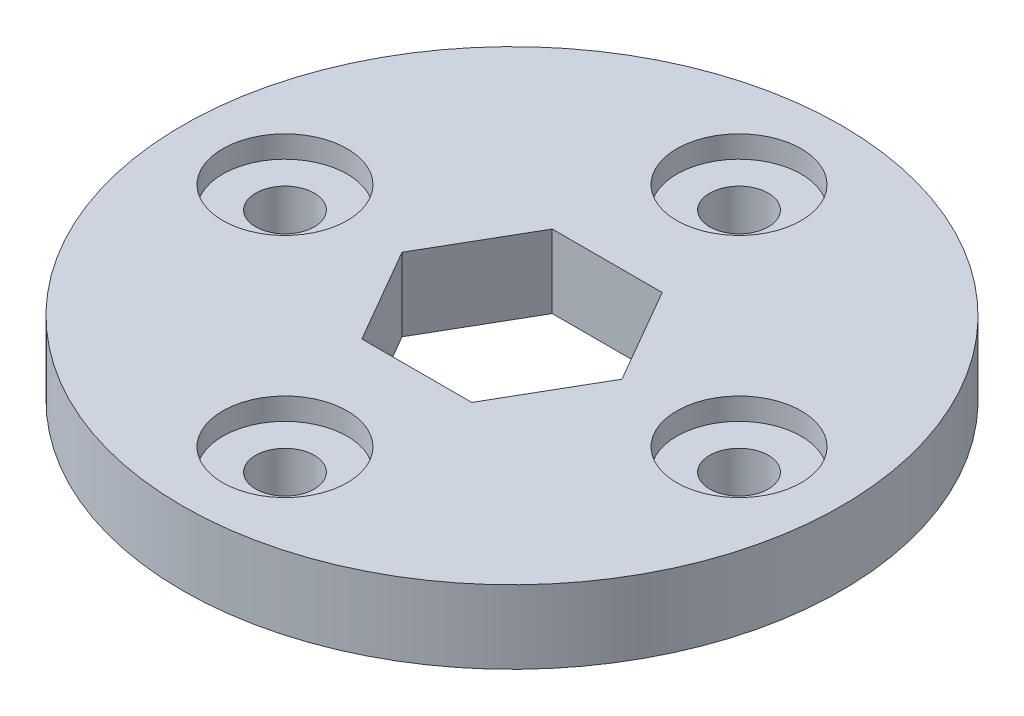
ISO-10303-21;
HEADER;
FILE_DESCRIPTION(('STEP AP214'),'2;1');
FILE_NAME('part.step','',(''),(''),'','','');
FILE_SCHEMA(('AUTOMOTIVE_DESIGN { 1 0 10303 214 1 1 1 1 }'));
ENDSEC;
DATA;
#1=APPLICATION_CONTEXT('core data for automotive mechanical design processes');
#2=APPLICATION_PROTOCOL_DEFINITION('international standard','automotive_design',2000,#1);
#3=PRODUCT_CONTEXT('',#1,'mechanical');
#4=PRODUCT('Part','Part','',(#3));
#5=PRODUCT_RELATED_PRODUCT_CATEGORY('part','',(#4));
#6=PRODUCT_DEFINITION_FORMATION('','',#4);
#7=PRODUCT_DEFINITION_CONTEXT('part definition',#1,'design');
#8=PRODUCT_DEFINITION('design','',#6,#7);
#9=PRODUCT_DEFINITION_SHAPE('','',#8);
#10=(LENGTH_UNIT() NAMED_UNIT(*) SI_UNIT(.MILLI.,.METRE.));
#11=(NAMED_UNIT(*) PLANE_ANGLE_UNIT() SI_UNIT($,.RADIAN.));
#12=(NAMED_UNIT(*) SI_UNIT($,.STERADIAN.) SOLID_ANGLE_UNIT());
#13=UNCERTAINTY_MEASURE_WITH_UNIT(LENGTH_MEASURE(1.E-05),#10,'distance_accuracy_value','');
#14=(GEOMETRIC_REPRESENTATION_CONTEXT(3) GLOBAL_UNCERTAINTY_ASSIGNED_CONTEXT((#13)) GLOBAL_UNIT_ASSIGNED_CONTEXT((#10,
#11,#12)) REPRESENTATION_CONTEXT('',''));
#15=CARTESIAN_POINT('',(0.,0.,0.));
#16=DIRECTION('',(0.,0.,1.));
#17=DIRECTION('',(1.,0.,0.));
#18=AXIS2_PLACEMENT_3D('',#15,#16,#17);
#19=CARTESIAN_POINT('',(0.,5.,-15.5));
#20=DIRECTION('',(0.,-1.,0.));
#21=DIRECTION('',(0.,0.,-1.));
#22=AXIS2_PLACEMENT_3D('',#19,#20,#21);
#23=CYLINDRICAL_SURFACE('',#22,2.);
#24=CARTESIAN_POINT('',(0.,0.,-15.5));
#25=DIRECTION('',(0.,1.,0.));
#26=DIRECTION('',(0.,0.,1.));
#27=AXIS2_PLACEMENT_3D('',#24,#25,#26);
#28=CIRCLE('',#27,2.);
#29=CARTESIAN_POINT('',(0.,0.,-13.5));
#30=VERTEX_POINT('',#29);
#31=EDGE_CURVE('E121',#30,#30,#28,.T.);
#32=ORIENTED_EDGE('',*,*,#31,.F.);
#33=EDGE_LOOP('',(#32));
#34=FACE_BOUND('',#33,.T.);
#35=CARTESIAN_POINT('',(0.,3.5,-15.5));
#36=DIRECTION('',(0.,1.,0.));
#37=DIRECTION('',(0.,0.,1.));
#38=AXIS2_PLACEMENT_3D('',#35,#36,#37);
#39=CIRCLE('',#38,2.);
#40=CARTESIAN_POINT('',(0.,3.5,-13.5));
#41=VERTEX_POINT('',#40);
#42=EDGE_CURVE('E37',#41,#41,#39,.T.);
#43=ORIENTED_EDGE('',*,*,#42,.T.);
#44=EDGE_LOOP('',(#43));
#45=FACE_BOUND('',#44,.T.);
#46=ADVANCED_FACE('F33',(#34,#45),#23,.F.);
#47=CARTESIAN_POINT('',(15.5000000000006,5.,-5.94375988270211E-13));
#48=DIRECTION('',(0.,-1.,0.));
#49=DIRECTION('',(0.,0.,-1.));
#50=AXIS2_PLACEMENT_3D('',#47,#48,#49);
#51=CYLINDRICAL_SURFACE('',#50,2.00000000000006);
#52=CARTESIAN_POINT('',(15.5000000000006,0.,-5.94375988270211E-13));
#53=DIRECTION('',(0.,1.,0.));
#54=DIRECTION('',(0.,0.,1.));
#55=AXIS2_PLACEMENT_3D('',#52,#53,#54);
#56=CIRCLE('',#55,2.00000000000006);
#57=CARTESIAN_POINT('',(15.5000000000006,0.,1.99999999999947));
#58=VERTEX_POINT('',#57);
#59=EDGE_CURVE('E163',#58,#58,#56,.T.);
#60=ORIENTED_EDGE('',*,*,#59,.F.);
#61=EDGE_LOOP('',(#60));
#62=FACE_BOUND('',#61,.T.);
#63=CARTESIAN_POINT('',(15.5000000000006,3.5,-5.94375988270211E-13));
#64=DIRECTION('',(0.,1.,0.));
#65=DIRECTION('',(0.,0.,1.));
#66=AXIS2_PLACEMENT_3D('',#63,#64,#65);
#67=CIRCLE('',#66,2.00000000000006);
#68=CARTESIAN_POINT('',(15.5000000000006,3.5,1.99999999999947));
#69=VERTEX_POINT('',#68);
#70=EDGE_CURVE('E149',#69,#69,#67,.T.);
#71=ORIENTED_EDGE('',*,*,#70,.T.);
#72=EDGE_LOOP('',(#71));
#73=FACE_BOUND('',#72,.T.);
#74=ADVANCED_FACE('F177',(#62,#73),#51,.F.);
#75=CARTESIAN_POINT('',(1.18875197654042E-12,5.,15.5));
#76=DIRECTION('',(0.,-1.,0.));
#77=DIRECTION('',(0.,0.,-1.));
#78=AXIS2_PLACEMENT_3D('',#75,#76,#77);
#79=CYLINDRICAL_SURFACE('',#78,2.);
#80=CARTESIAN_POINT('',(1.18875197654042E-12,0.,15.5));
#81=DIRECTION('',(0.,1.,0.));
#82=DIRECTION('',(0.,0.,1.));
#83=AXIS2_PLACEMENT_3D('',#80,#81,#82);
#84=CIRCLE('',#83,2.);
#85=CARTESIAN_POINT('',(1.18875197654042E-12,0.,17.5));
#86=VERTEX_POINT('',#85);
#87=EDGE_CURVE('E158',#86,#86,#84,.T.);
#88=ORIENTED_EDGE('',*,*,#87,.F.);
#89=EDGE_LOOP('',(#88));
#90=FACE_BOUND('',#89,.T.);
#91=CARTESIAN_POINT('',(1.18875197654042E-12,3.5,15.5));
#92=DIRECTION('',(0.,1.,0.));
#93=DIRECTION('',(0.,0.,1.));
#94=AXIS2_PLACEMENT_3D('',#91,#92,#93);
#95=CIRCLE('',#94,2.);
#96=CARTESIAN_POINT('',(1.18875197654042E-12,3.5,17.5));
#97=VERTEX_POINT('',#96);
#98=EDGE_CURVE('E146',#97,#97,#95,.T.);
#99=ORIENTED_EDGE('',*,*,#98,.T.);
#100=EDGE_LOOP('',(#99));
#101=FACE_BOUND('',#100,.T.);
#102=ADVANCED_FACE('F182',(#90,#101),#79,.F.);
#103=CARTESIAN_POINT('',(-15.4999999999994,5.,5.96274190808889E-13));
#104=DIRECTION('',(0.,-1.,0.));
#105=DIRECTION('',(0.,0.,-1.));
#106=AXIS2_PLACEMENT_3D('',#103,#104,#105);
#107=CYLINDRICAL_SURFACE('',#106,1.99999999999998);
#108=CARTESIAN_POINT('',(-15.4999999999994,0.,5.96274190808889E-13));
#109=DIRECTION('',(0.,1.,0.));
#110=DIRECTION('',(0.,0.,1.));
#111=AXIS2_PLACEMENT_3D('',#108,#109,#110);
#112=CIRCLE('',#111,1.99999999999998);
#113=CARTESIAN_POINT('',(-15.4999999999994,0.,2.00000000000058));
#114=VERTEX_POINT('',#113);
#115=EDGE_CURVE('E154',#114,#114,#112,.T.);
#116=ORIENTED_EDGE('',*,*,#115,.F.);
#117=EDGE_LOOP('',(#116));
#118=FACE_BOUND('',#117,.T.);
#119=CARTESIAN_POINT('',(-15.4999999999994,3.5,5.96274190808889E-13));
#120=DIRECTION('',(0.,1.,0.));
#121=DIRECTION('',(0.,0.,1.));
#122=AXIS2_PLACEMENT_3D('',#119,#120,#121);
#123=CIRCLE('',#122,1.99999999999998);
#124=CARTESIAN_POINT('',(-15.4999999999994,3.5,2.00000000000058));
#125=VERTEX_POINT('',#124);
#126=EDGE_CURVE('E143',#125,#125,#123,.T.);
#127=ORIENTED_EDGE('',*,*,#126,.T.);
#128=EDGE_LOOP('',(#127));
#129=FACE_BOUND('',#128,.T.);
#130=ADVANCED_FACE('F208',(#118,#129),#107,.F.);
#131=CARTESIAN_POINT('',(0.,5.,0.));
#132=DIRECTION('',(0.,1.,0.));
#133=DIRECTION('',(0.,0.,1.));
#134=AXIS2_PLACEMENT_3D('',#131,#132,#133);
#135=PLANE('',#134);
#136=CARTESIAN_POINT('',(1.18875197654042E-12,5.,-15.5));
#137=DIRECTION('',(0.,1.,0.));
#138=DIRECTION('',(0.,0.,1.));
#139=AXIS2_PLACEMENT_3D('',#136,#137,#138);
#140=CIRCLE('',#139,4.25);
#141=CARTESIAN_POINT('',(1.18875197654042E-12,5.,-11.25));
#142=VERTEX_POINT('',#141);
#143=EDGE_CURVE('E405',#142,#142,#140,.T.);
#144=ORIENTED_EDGE('',*,*,#143,.F.);
#145=EDGE_LOOP('',(#144));
#146=FACE_BOUND('',#145,.T.);
#147=CARTESIAN_POINT('',(15.5,5.,1.18780287527108E-12));
#148=DIRECTION('',(0.,1.,0.));
#149=DIRECTION('',(0.,0.,1.));
#150=AXIS2_PLACEMENT_3D('',#147,#148,#149);
#151=CIRCLE('',#150,4.25);
#152=CARTESIAN_POINT('',(15.5,5.,4.25000000000119));
#153=VERTEX_POINT('',#152);
#154=EDGE_CURVE('E399',#153,#153,#151,.T.);
#155=ORIENTED_EDGE('',*,*,#154,.F.);
#156=EDGE_LOOP('',(#155));
#157=FACE_BOUND('',#156,.T.);
#158=CARTESIAN_POINT('',(-1.18685377400174E-12,5.,15.5));
#159=DIRECTION('',(0.,1.,0.));
#160=DIRECTION('',(0.,0.,1.));
#161=AXIS2_PLACEMENT_3D('',#158,#159,#160);
#162=CIRCLE('',#161,4.25);
#163=CARTESIAN_POINT('',(-1.18685377400174E-12,5.,19.75));
#164=VERTEX_POINT('',#163);
#165=EDGE_CURVE('E391',#164,#164,#162,.T.);
#166=ORIENTED_EDGE('',*,*,#165,.F.);
#167=EDGE_LOOP('',(#166));
#168=FACE_BOUND('',#167,.T.);
#169=CARTESIAN_POINT('',(-15.5,5.,-1.1859046727324E-12));
#170=DIRECTION('',(0.,1.,0.));
#171=DIRECTION('',(0.,0.,1.));
#172=AXIS2_PLACEMENT_3D('',#169,#170,#171);
#173=CIRCLE('',#172,4.25);
#174=CARTESIAN_POINT('',(-15.5,5.,4.24999999999881));
#175=VERTEX_POINT('',#174);
#176=EDGE_CURVE('E166',#175,#175,#173,.T.);
#177=ORIENTED_EDGE('',*,*,#176,.F.);
#178=EDGE_LOOP('',(#177));
#179=FACE_BOUND('',#178,.T.);
#180=CARTESIAN_POINT('',(0.,5.,0.));
#181=DIRECTION('',(0.,1.,0.));
#182=DIRECTION('',(0.,0.,1.));
#183=AXIS2_PLACEMENT_3D('',#180,#181,#182);
#184=CIRCLE('',#183,22.5);
#185=CARTESIAN_POINT('',(0.,5.,22.5));
#186=VERTEX_POINT('',#185);
#187=EDGE_CURVE('E11',#186,#186,#184,.T.);
#188=ORIENTED_EDGE('',*,*,#187,.T.);
#189=EDGE_LOOP('',(#188));
#190=FACE_BOUND('',#189,.T.);
#191=DIRECTION('',(-0.5,0.,-0.866025403784439));
#192=VECTOR('',#191,1.);
#193=CARTESIAN_POINT('',(7.50555349946513,5.,0.));
#194=LINE('',#193,#192);
#195=CARTESIAN_POINT('',(7.50555349946513,5.,0.));
#196=VERTEX_POINT('',#195);
#197=CARTESIAN_POINT('',(3.75277674973256,5.,-6.5));
#198=VERTEX_POINT('',#197);
#199=EDGE_CURVE('E96',#196,#198,#194,.T.);
#200=ORIENTED_EDGE('',*,*,#199,.F.);
#201=DIRECTION('',(0.5,0.,-0.866025403784439));
#202=VECTOR('',#201,1.);
#203=CARTESIAN_POINT('',(3.75277674973257,5.,6.5));
#204=LINE('',#203,#202);
#205=CARTESIAN_POINT('',(3.75277674973257,5.,6.5));
#206=VERTEX_POINT('',#205);
#207=EDGE_CURVE('E88',#206,#196,#204,.T.);
#208=ORIENTED_EDGE('',*,*,#207,.F.);
#209=DIRECTION('',(1.,0.,0.));
#210=VECTOR('',#209,1.);
#211=CARTESIAN_POINT('',(-3.75277674973257,5.,6.5));
#212=LINE('',#211,#210);
#213=CARTESIAN_POINT('',(-3.75277674973257,5.,6.5));
#214=VERTEX_POINT('',#213);
#215=EDGE_CURVE('E118',#214,#206,#212,.T.);
#216=ORIENTED_EDGE('',*,*,#215,.F.);
#217=DIRECTION('',(0.5,0.,0.866025403784439));
#218=VECTOR('',#217,1.);
#219=CARTESIAN_POINT('',(-7.50555349946514,5.,0.));
#220=LINE('',#219,#218);
#221=CARTESIAN_POINT('',(-7.50555349946514,5.,0.));
#222=VERTEX_POINT('',#221);
#223=EDGE_CURVE('E116',#222,#214,#220,.T.);
#224=ORIENTED_EDGE('',*,*,#223,.F.);
#225=DIRECTION('',(-0.5,0.,0.866025403784439));
#226=VECTOR('',#225,1.);
#227=CARTESIAN_POINT('',(-3.75277674973257,5.,-6.5));
#228=LINE('',#227,#226);
#229=CARTESIAN_POINT('',(-3.75277674973257,5.,-6.5));
#230=VERTEX_POINT('',#229);
#231=EDGE_CURVE('E111',#230,#222,#228,.T.);
#232=ORIENTED_EDGE('',*,*,#231,.F.);
#233=DIRECTION('',(-1.,0.,0.));
#234=VECTOR('',#233,1.);
#235=CARTESIAN_POINT('',(3.75277674973256,5.,-6.5));
#236=LINE('',#235,#234);
#237=EDGE_CURVE('E109',#198,#230,#236,.T.);
#238=ORIENTED_EDGE('',*,*,#237,.F.);
#239=EDGE_LOOP('',(#200,#208,#216,#224,#232,#238));
#240=FACE_BOUND('',#239,.T.);
#241=ADVANCED_FACE('F107',(#146,#157,#168,#179,#190,#240),#135,.T.);
#242=CARTESIAN_POINT('',(0.,0.,0.));
#243=DIRECTION('',(0.,1.,0.));
#244=DIRECTION('',(0.,0.,1.));
#245=AXIS2_PLACEMENT_3D('',#242,#243,#244);
#246=PLANE('',#245);
#247=CARTESIAN_POINT('',(0.,0.,0.));
#248=DIRECTION('',(0.,1.,0.));
#249=DIRECTION('',(0.,0.,1.));
#250=AXIS2_PLACEMENT_3D('',#247,#248,#249);
#251=CIRCLE('',#250,22.5);
#252=CARTESIAN_POINT('',(0.,0.,22.5));
#253=VERTEX_POINT('',#252);
#254=EDGE_CURVE('E42',#253,#253,#251,.T.);
#255=ORIENTED_EDGE('',*,*,#254,.F.);
#256=EDGE_LOOP('',(#255));
#257=FACE_BOUND('',#256,.T.);
#258=DIRECTION('',(0.5,0.,-0.866025403784439));
#259=VECTOR('',#258,1.);
#260=CARTESIAN_POINT('',(3.75277674973257,0.,6.5));
#261=LINE('',#260,#259);
#262=CARTESIAN_POINT('',(3.75277674973257,0.,6.5));
#263=VERTEX_POINT('',#262);
#264=CARTESIAN_POINT('',(7.50555349946513,0.,0.));
#265=VERTEX_POINT('',#264);
#266=EDGE_CURVE('E58',#263,#265,#261,.T.);
#267=ORIENTED_EDGE('',*,*,#266,.T.);
#268=DIRECTION('',(-0.5,0.,-0.866025403784439));
#269=VECTOR('',#268,1.);
#270=CARTESIAN_POINT('',(7.50555349946513,0.,0.));
#271=LINE('',#270,#269);
#272=CARTESIAN_POINT('',(3.75277674973256,0.,-6.5));
#273=VERTEX_POINT('',#272);
#274=EDGE_CURVE('E103',#265,#273,#271,.T.);
#275=ORIENTED_EDGE('',*,*,#274,.T.);
#276=DIRECTION('',(-1.,0.,0.));
#277=VECTOR('',#276,1.);
#278=CARTESIAN_POINT('',(3.75277674973256,0.,-6.5));
#279=LINE('',#278,#277);
#280=CARTESIAN_POINT('',(-3.75277674973257,0.,-6.5));
#281=VERTEX_POINT('',#280);
#282=EDGE_CURVE('E123',#273,#281,#279,.T.);
#283=ORIENTED_EDGE('',*,*,#282,.T.);
#284=DIRECTION('',(-0.5,0.,0.866025403784439));
#285=VECTOR('',#284,1.);
#286=CARTESIAN_POINT('',(-3.75277674973257,0.,-6.5));
#287=LINE('',#286,#285);
#288=CARTESIAN_POINT('',(-7.50555349946514,0.,0.));
#289=VERTEX_POINT('',#288);
#290=EDGE_CURVE('E126',#281,#289,#287,.T.);
#291=ORIENTED_EDGE('',*,*,#290,.T.);
#292=DIRECTION('',(0.5,0.,0.866025403784439));
#293=VECTOR('',#292,1.);
#294=CARTESIAN_POINT('',(-7.50555349946514,0.,0.));
#295=LINE('',#294,#293);
#296=CARTESIAN_POINT('',(-3.75277674973257,0.,6.5));
#297=VERTEX_POINT('',#296);
#298=EDGE_CURVE('E129',#289,#297,#295,.T.);
#299=ORIENTED_EDGE('',*,*,#298,.T.);
#300=DIRECTION('',(1.,0.,0.));
#301=VECTOR('',#300,1.);
#302=CARTESIAN_POINT('',(-3.75277674973257,0.,6.5));
#303=LINE('',#302,#301);
#304=EDGE_CURVE('E97',#297,#263,#303,.T.);
#305=ORIENTED_EDGE('',*,*,#304,.T.);
#306=EDGE_LOOP('',(#267,#275,#283,#291,#299,#305));
#307=FACE_BOUND('',#306,.T.);
#308=ORIENTED_EDGE('',*,*,#31,.T.);
#309=EDGE_LOOP('',(#308));
#310=FACE_BOUND('',#309,.T.);
#311=ORIENTED_EDGE('',*,*,#59,.T.);
#312=EDGE_LOOP('',(#311));
#313=FACE_BOUND('',#312,.T.);
#314=ORIENTED_EDGE('',*,*,#87,.T.);
#315=EDGE_LOOP('',(#314));
#316=FACE_BOUND('',#315,.T.);
#317=ORIENTED_EDGE('',*,*,#115,.T.);
#318=EDGE_LOOP('',(#317));
#319=FACE_BOUND('',#318,.T.);
#320=ADVANCED_FACE('F173',(#257,#307,#310,#313,#316,#319),#246,.F.);
#321=CARTESIAN_POINT('',(0.,5.,0.));
#322=DIRECTION('',(0.,-1.,0.));
#323=DIRECTION('',(0.,0.,-1.));
#324=AXIS2_PLACEMENT_3D('',#321,#322,#323);
#325=CYLINDRICAL_SURFACE('',#324,22.5);
#326=ORIENTED_EDGE('',*,*,#187,.F.);
#327=EDGE_LOOP('',(#326));
#328=FACE_BOUND('',#327,.T.);
#329=ORIENTED_EDGE('',*,*,#254,.T.);
#330=EDGE_LOOP('',(#329));
#331=FACE_BOUND('',#330,.T.);
#332=ADVANCED_FACE('F35',(#328,#331),#325,.T.);
#333=CARTESIAN_POINT('',(3.75277674973257,5.,6.5));
#334=DIRECTION('',(-0.866025403784439,0.,-0.5));
#335=DIRECTION('',(-0.5,0.,0.866025403784439));
#336=AXIS2_PLACEMENT_3D('',#333,#334,#335);
#337=PLANE('',#336);
#338=ORIENTED_EDGE('',*,*,#266,.F.);
#339=DIRECTION('',(0.,-1.,0.));
#340=VECTOR('',#339,1.);
#341=CARTESIAN_POINT('',(3.75277674973257,5.,6.5));
#342=LINE('',#341,#340);
#343=EDGE_CURVE('E92',#206,#263,#342,.T.);
#344=ORIENTED_EDGE('',*,*,#343,.F.);
#345=ORIENTED_EDGE('',*,*,#207,.T.);
#346=DIRECTION('',(0.,-1.,0.));
#347=VECTOR('',#346,1.);
#348=CARTESIAN_POINT('',(7.50555349946513,5.,0.));
#349=LINE('',#348,#347);
#350=EDGE_CURVE('E91',#196,#265,#349,.T.);
#351=ORIENTED_EDGE('',*,*,#350,.T.);
#352=EDGE_LOOP('',(#338,#344,#345,#351));
#353=FACE_BOUND('',#352,.T.);
#354=ADVANCED_FACE('F90',(#353),#337,.T.);
#355=CARTESIAN_POINT('',(7.50555349946513,5.,0.));
#356=DIRECTION('',(-0.866025403784438,0.,0.5));
#357=DIRECTION('',(0.5,0.,0.866025403784439));
#358=AXIS2_PLACEMENT_3D('',#355,#356,#357);
#359=PLANE('',#358);
#360=ORIENTED_EDGE('',*,*,#274,.F.);
#361=ORIENTED_EDGE('',*,*,#350,.F.);
#362=ORIENTED_EDGE('',*,*,#199,.T.);
#363=DIRECTION('',(0.,-1.,0.));
#364=VECTOR('',#363,1.);
#365=CARTESIAN_POINT('',(3.75277674973256,5.,-6.5));
#366=LINE('',#365,#364);
#367=EDGE_CURVE('E104',#198,#273,#366,.T.);
#368=ORIENTED_EDGE('',*,*,#367,.T.);
#369=EDGE_LOOP('',(#360,#361,#362,#368));
#370=FACE_BOUND('',#369,.T.);
#371=ADVANCED_FACE('F100',(#370),#359,.T.);
#372=CARTESIAN_POINT('',(3.75277674973256,5.,-6.5));
#373=DIRECTION('',(0.,0.,1.));
#374=DIRECTION('',(1.,0.,0.));
#375=AXIS2_PLACEMENT_3D('',#372,#373,#374);
#376=PLANE('',#375);
#377=ORIENTED_EDGE('',*,*,#282,.F.);
#378=ORIENTED_EDGE('',*,*,#367,.F.);
#379=ORIENTED_EDGE('',*,*,#237,.T.);
#380=DIRECTION('',(0.,-1.,0.));
#381=VECTOR('',#380,1.);
#382=CARTESIAN_POINT('',(-3.75277674973257,5.,-6.5));
#383=LINE('',#382,#381);
#384=EDGE_CURVE('E138',#230,#281,#383,.T.);
#385=ORIENTED_EDGE('',*,*,#384,.T.);
#386=EDGE_LOOP('',(#377,#378,#379,#385));
#387=FACE_BOUND('',#386,.T.);
#388=ADVANCED_FACE('F198',(#387),#376,.T.);
#389=CARTESIAN_POINT('',(-3.75277674973257,5.,-6.5));
#390=DIRECTION('',(0.866025403784439,0.,0.5));
#391=DIRECTION('',(0.5,0.,-0.866025403784439));
#392=AXIS2_PLACEMENT_3D('',#389,#390,#391);
#393=PLANE('',#392);
#394=ORIENTED_EDGE('',*,*,#290,.F.);
#395=ORIENTED_EDGE('',*,*,#384,.F.);
#396=ORIENTED_EDGE('',*,*,#231,.T.);
#397=DIRECTION('',(0.,-1.,0.));
#398=VECTOR('',#397,1.);
#399=CARTESIAN_POINT('',(-7.50555349946514,5.,0.));
#400=LINE('',#399,#398);
#401=EDGE_CURVE('E136',#222,#289,#400,.T.);
#402=ORIENTED_EDGE('',*,*,#401,.T.);
#403=EDGE_LOOP('',(#394,#395,#396,#402));
#404=FACE_BOUND('',#403,.T.);
#405=ADVANCED_FACE('F194',(#404),#393,.T.);
#406=CARTESIAN_POINT('',(-7.50555349946514,5.,0.));
#407=DIRECTION('',(0.866025403784439,0.,-0.5));
#408=DIRECTION('',(-0.5,0.,-0.866025403784439));
#409=AXIS2_PLACEMENT_3D('',#406,#407,#408);
#410=PLANE('',#409);
#411=ORIENTED_EDGE('',*,*,#298,.F.);
#412=ORIENTED_EDGE('',*,*,#401,.F.);
#413=ORIENTED_EDGE('',*,*,#223,.T.);
#414=DIRECTION('',(0.,-1.,0.));
#415=VECTOR('',#414,1.);
#416=CARTESIAN_POINT('',(-3.75277674973257,5.,6.5));
#417=LINE('',#416,#415);
#418=EDGE_CURVE('E50',#214,#297,#417,.T.);
#419=ORIENTED_EDGE('',*,*,#418,.T.);
#420=EDGE_LOOP('',(#411,#412,#413,#419));
#421=FACE_BOUND('',#420,.T.);
#422=ADVANCED_FACE('F191',(#421),#410,.T.);
#423=CARTESIAN_POINT('',(-3.75277674973257,5.,6.5));
#424=DIRECTION('',(0.,0.,-1.));
#425=DIRECTION('',(-1.,0.,0.));
#426=AXIS2_PLACEMENT_3D('',#423,#424,#425);
#427=PLANE('',#426);
#428=ORIENTED_EDGE('',*,*,#304,.F.);
#429=ORIENTED_EDGE('',*,*,#418,.F.);
#430=ORIENTED_EDGE('',*,*,#215,.T.);
#431=ORIENTED_EDGE('',*,*,#343,.T.);
#432=EDGE_LOOP('',(#428,#429,#430,#431));
#433=FACE_BOUND('',#432,.T.);
#434=ADVANCED_FACE('F187',(#433),#427,.T.);
#435=CARTESIAN_POINT('',(-15.5,3.5,-1.1859046727324E-12));
#436=DIRECTION('',(0.,1.,0.));
#437=DIRECTION('',(0.,0.,1.));
#438=AXIS2_PLACEMENT_3D('',#435,#436,#437);
#439=CYLINDRICAL_SURFACE('',#438,4.25);
#440=CARTESIAN_POINT('',(-15.5,3.5,-1.1859046727324E-12));
#441=DIRECTION('',(0.,1.,0.));
#442=DIRECTION('',(0.,0.,1.));
#443=AXIS2_PLACEMENT_3D('',#440,#441,#442);
#444=CIRCLE('',#443,4.25);
#445=CARTESIAN_POINT('',(-15.5,3.5,4.24999999999881));
#446=VERTEX_POINT('',#445);
#447=EDGE_CURVE('E390',#446,#446,#444,.T.);
#448=ORIENTED_EDGE('',*,*,#447,.F.);
#449=EDGE_LOOP('',(#448));
#450=FACE_BOUND('',#449,.T.);
#451=ORIENTED_EDGE('',*,*,#176,.T.);
#452=EDGE_LOOP('',(#451));
#453=FACE_BOUND('',#452,.T.);
#454=ADVANCED_FACE('F190',(#450,#453),#439,.F.);
#455=CARTESIAN_POINT('',(-15.5,3.5,-1.1859046727324E-12));
#456=DIRECTION('',(0.,1.,0.));
#457=DIRECTION('',(0.,0.,1.));
#458=AXIS2_PLACEMENT_3D('',#455,#456,#457);
#459=PLANE('',#458);
#460=ORIENTED_EDGE('',*,*,#126,.F.);
#461=EDGE_LOOP('',(#460));
#462=FACE_BOUND('',#461,.T.);
#463=ORIENTED_EDGE('',*,*,#447,.T.);
#464=EDGE_LOOP('',(#463));
#465=FACE_BOUND('',#464,.T.);
#466=ADVANCED_FACE('F259',(#462,#465),#459,.T.);
#467=CARTESIAN_POINT('',(-1.18685377400174E-12,3.5,15.5));
#468=DIRECTION('',(0.,1.,0.));
#469=DIRECTION('',(0.,0.,1.));
#470=AXIS2_PLACEMENT_3D('',#467,#468,#469);
#471=CYLINDRICAL_SURFACE('',#470,4.25);
#472=CARTESIAN_POINT('',(-1.18685377400174E-12,3.5,15.5));
#473=DIRECTION('',(0.,1.,0.));
#474=DIRECTION('',(0.,0.,1.));
#475=AXIS2_PLACEMENT_3D('',#472,#473,#474);
#476=CIRCLE('',#475,4.25);
#477=CARTESIAN_POINT('',(-1.18685377400174E-12,3.5,19.75));
#478=VERTEX_POINT('',#477);
#479=EDGE_CURVE('E393',#478,#478,#476,.T.);
#480=ORIENTED_EDGE('',*,*,#479,.F.);
#481=EDGE_LOOP('',(#480));
#482=FACE_BOUND('',#481,.T.);
#483=ORIENTED_EDGE('',*,*,#165,.T.);
#484=EDGE_LOOP('',(#483));
#485=FACE_BOUND('',#484,.T.);
#486=ADVANCED_FACE('F268',(#482,#485),#471,.F.);
#487=CARTESIAN_POINT('',(-1.18685377400174E-12,3.5,15.5));
#488=DIRECTION('',(0.,1.,0.));
#489=DIRECTION('',(0.,0.,1.));
#490=AXIS2_PLACEMENT_3D('',#487,#488,#489);
#491=PLANE('',#490);
#492=ORIENTED_EDGE('',*,*,#98,.F.);
#493=EDGE_LOOP('',(#492));
#494=FACE_BOUND('',#493,.T.);
#495=ORIENTED_EDGE('',*,*,#479,.T.);
#496=EDGE_LOOP('',(#495));
#497=FACE_BOUND('',#496,.T.);
#498=ADVANCED_FACE('F276',(#494,#497),#491,.T.);
#499=CARTESIAN_POINT('',(15.5,3.5,1.18780287527108E-12));
#500=DIRECTION('',(0.,1.,0.));
#501=DIRECTION('',(0.,0.,1.));
#502=AXIS2_PLACEMENT_3D('',#499,#500,#501);
#503=CYLINDRICAL_SURFACE('',#502,4.25);
#504=CARTESIAN_POINT('',(15.5,3.5,1.18780287527108E-12));
#505=DIRECTION('',(0.,1.,0.));
#506=DIRECTION('',(0.,0.,1.));
#507=AXIS2_PLACEMENT_3D('',#504,#505,#506);
#508=CIRCLE('',#507,4.25);
#509=CARTESIAN_POINT('',(15.5,3.5,4.25000000000119));
#510=VERTEX_POINT('',#509);
#511=EDGE_CURVE('E402',#510,#510,#508,.T.);
#512=ORIENTED_EDGE('',*,*,#511,.F.);
#513=EDGE_LOOP('',(#512));
#514=FACE_BOUND('',#513,.T.);
#515=ORIENTED_EDGE('',*,*,#154,.T.);
#516=EDGE_LOOP('',(#515));
#517=FACE_BOUND('',#516,.T.);
#518=ADVANCED_FACE('F284',(#514,#517),#503,.F.);
#519=CARTESIAN_POINT('',(15.5,3.5,1.18780287527108E-12));
#520=DIRECTION('',(0.,1.,0.));
#521=DIRECTION('',(0.,0.,1.));
#522=AXIS2_PLACEMENT_3D('',#519,#520,#521);
#523=PLANE('',#522);
#524=ORIENTED_EDGE('',*,*,#70,.F.);
#525=EDGE_LOOP('',(#524));
#526=FACE_BOUND('',#525,.T.);
#527=ORIENTED_EDGE('',*,*,#511,.T.);
#528=EDGE_LOOP('',(#527));
#529=FACE_BOUND('',#528,.T.);
#530=ADVANCED_FACE('F292',(#526,#529),#523,.T.);
#531=CARTESIAN_POINT('',(1.18875197654042E-12,3.5,-15.5));
#532=DIRECTION('',(0.,1.,0.));
#533=DIRECTION('',(0.,0.,1.));
#534=AXIS2_PLACEMENT_3D('',#531,#532,#533);
#535=CYLINDRICAL_SURFACE('',#534,4.25);
#536=CARTESIAN_POINT('',(1.18875197654042E-12,3.5,-15.5));
#537=DIRECTION('',(0.,1.,0.));
#538=DIRECTION('',(0.,0.,1.));
#539=AXIS2_PLACEMENT_3D('',#536,#537,#538);
#540=CIRCLE('',#539,4.25);
#541=CARTESIAN_POINT('',(1.18875197654042E-12,3.5,-11.25));
#542=VERTEX_POINT('',#541);
#543=EDGE_CURVE('E147',#542,#542,#540,.T.);
#544=ORIENTED_EDGE('',*,*,#543,.F.);
#545=EDGE_LOOP('',(#544));
#546=FACE_BOUND('',#545,.T.);
#547=ORIENTED_EDGE('',*,*,#143,.T.);
#548=EDGE_LOOP('',(#547));
#549=FACE_BOUND('',#548,.T.);
#550=ADVANCED_FACE('F300',(#546,#549),#535,.F.);
#551=CARTESIAN_POINT('',(1.18875197654042E-12,3.5,-15.5));
#552=DIRECTION('',(0.,1.,0.));
#553=DIRECTION('',(0.,0.,1.));
#554=AXIS2_PLACEMENT_3D('',#551,#552,#553);
#555=PLANE('',#554);
#556=ORIENTED_EDGE('',*,*,#42,.F.);
#557=EDGE_LOOP('',(#556));
#558=FACE_BOUND('',#557,.T.);
#559=ORIENTED_EDGE('',*,*,#543,.T.);
#560=EDGE_LOOP('',(#559));
#561=FACE_BOUND('',#560,.T.);
#562=ADVANCED_FACE('F308',(#558,#561),#555,.T.);
#563=CLOSED_SHELL('',(#46,#74,#102,#130,#241,#320,#332,#354,#371,#388,#405,#422,#434,#454,#466,
#486,#498,#518,#530,#550,#562));
#564=MANIFOLD_SOLID_BREP('B2',#563);
#565=ADVANCED_BREP_SHAPE_REPRESENTATION('',(#18,#564),#14);
#566=SHAPE_DEFINITION_REPRESENTATION(#9,#565);
ENDSEC;
END-ISO-10303-21;
